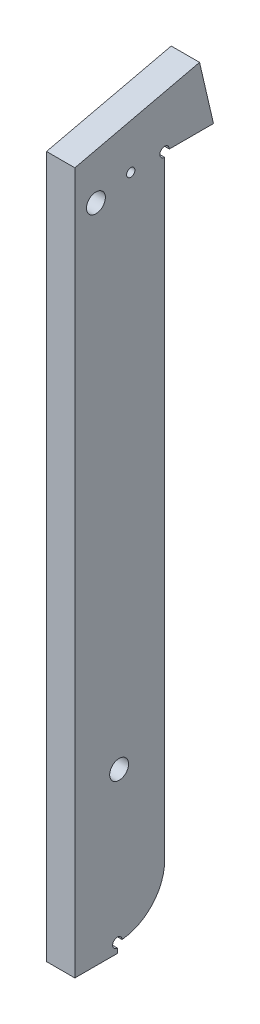
ISO-10303-21;
HEADER;
FILE_DESCRIPTION(('STEP AP214'),'2;1');
FILE_NAME('part.step','',(''),(''),'','','');
FILE_SCHEMA(('AUTOMOTIVE_DESIGN { 1 0 10303 214 1 1 1 1 }'));
ENDSEC;
DATA;
#1=APPLICATION_CONTEXT('core data for automotive mechanical design processes');
#2=APPLICATION_PROTOCOL_DEFINITION('international standard','automotive_design',2000,#1);
#3=PRODUCT_CONTEXT('',#1,'mechanical');
#4=PRODUCT('Part','Part','',(#3));
#5=PRODUCT_RELATED_PRODUCT_CATEGORY('part','',(#4));
#6=PRODUCT_DEFINITION_FORMATION('','',#4);
#7=PRODUCT_DEFINITION_CONTEXT('part definition',#1,'design');
#8=PRODUCT_DEFINITION('design','',#6,#7);
#9=PRODUCT_DEFINITION_SHAPE('','',#8);
#10=(LENGTH_UNIT() NAMED_UNIT(*) SI_UNIT(.MILLI.,.METRE.));
#11=(NAMED_UNIT(*) PLANE_ANGLE_UNIT() SI_UNIT($,.RADIAN.));
#12=(NAMED_UNIT(*) SI_UNIT($,.STERADIAN.) SOLID_ANGLE_UNIT());
#13=UNCERTAINTY_MEASURE_WITH_UNIT(LENGTH_MEASURE(1.E-05),#10,'distance_accuracy_value','');
#14=(GEOMETRIC_REPRESENTATION_CONTEXT(3) GLOBAL_UNCERTAINTY_ASSIGNED_CONTEXT((#13)) GLOBAL_UNIT_ASSIGNED_CONTEXT((#10,
#11,#12)) REPRESENTATION_CONTEXT('',''));
#15=CARTESIAN_POINT('',(0.,0.,0.));
#16=DIRECTION('',(0.,0.,1.));
#17=DIRECTION('',(1.,0.,0.));
#18=AXIS2_PLACEMENT_3D('',#15,#16,#17);
#19=CARTESIAN_POINT('',(-228.088766336441,1.77635683940025E-12,-66.675));
#20=DIRECTION('',(1.,0.,0.));
#21=DIRECTION('',(0.,1.,0.));
#22=AXIS2_PLACEMENT_3D('',#19,#20,#21);
#23=PLANE('',#22);
#24=CARTESIAN_POINT('',(-228.088766336441,-0.660555348845376,-37.580125219567));
#25=DIRECTION('',(1.,0.,0.));
#26=DIRECTION('',(0.,0.,-1.));
#27=AXIS2_PLACEMENT_3D('',#24,#25,#26);
#28=CIRCLE('',#27,6.35000000000002);
#29=CARTESIAN_POINT('',(-228.088766336441,-0.660555348845376,-43.930125219567));
#30=VERTEX_POINT('',#29);
#31=EDGE_CURVE('E232',#30,#30,#28,.T.);
#32=ORIENTED_EDGE('',*,*,#31,.T.);
#33=EDGE_LOOP('',(#32));
#34=FACE_BOUND('',#33,.T.);
#35=DIRECTION('',(0.,-1.,0.));
#36=VECTOR('',#35,1.);
#37=CARTESIAN_POINT('',(-228.088766336441,-450.85,-28.575));
#38=LINE('',#37,#36);
#39=CARTESIAN_POINT('',(-228.088766336441,-447.675,-28.575));
#40=VERTEX_POINT('',#39);
#41=CARTESIAN_POINT('',(-228.088766336441,-450.85,-28.575));
#42=VERTEX_POINT('',#41);
#43=EDGE_CURVE('E140',#40,#42,#38,.T.);
#44=ORIENTED_EDGE('',*,*,#43,.T.);
#45=DIRECTION('',(0.,0.,1.));
#46=VECTOR('',#45,1.);
#47=CARTESIAN_POINT('',(-228.088766336441,-450.85,-66.675));
#48=LINE('',#47,#46);
#49=CARTESIAN_POINT('',(-228.088766336441,-450.85,0.));
#50=VERTEX_POINT('',#49);
#51=EDGE_CURVE('E156',#42,#50,#48,.T.);
#52=ORIENTED_EDGE('',*,*,#51,.T.);
#53=DIRECTION('',(0.,-1.,0.));
#54=VECTOR('',#53,1.);
#55=CARTESIAN_POINT('',(-228.088766336441,1.77635683940025E-12,0.));
#56=LINE('',#55,#54);
#57=CARTESIAN_POINT('',(-228.088766336441,20.8246330030108,0.));
#58=VERTEX_POINT('',#57);
#59=EDGE_CURVE('E144',#58,#50,#56,.T.);
#60=ORIENTED_EDGE('',*,*,#59,.F.);
#61=DIRECTION('',(0.,-0.226373338950912,0.974040610761284));
#62=VECTOR('',#61,1.);
#63=CARTESIAN_POINT('',(-228.088766336441,34.844553241799,-60.325));
#64=LINE('',#63,#62);
#65=CARTESIAN_POINT('',(-228.088766336441,40.3069419106845,-83.8285999376698));
#66=VERTEX_POINT('',#65);
#67=EDGE_CURVE('E192',#66,#58,#64,.T.);
#68=ORIENTED_EDGE('',*,*,#67,.F.);
#69=DIRECTION('',(0.,0.974040610761285,0.226373338950908));
#70=VECTOR('',#69,1.);
#71=CARTESIAN_POINT('',(-228.088766336441,40.3069419106845,-83.8285999376698));
#72=LINE('',#71,#70);
#73=CARTESIAN_POINT('',(-228.088766336441,0.,-93.19619398089));
#74=VERTEX_POINT('',#73);
#75=EDGE_CURVE('E183',#74,#66,#72,.T.);
#76=ORIENTED_EDGE('',*,*,#75,.F.);
#77=DIRECTION('',(0.,0.,-1.));
#78=VECTOR('',#77,1.);
#79=CARTESIAN_POINT('',(-228.088766336441,0.,-93.19619398089));
#80=LINE('',#79,#78);
#81=CARTESIAN_POINT('',(-228.088766336441,0.,-63.5));
#82=VERTEX_POINT('',#81);
#83=EDGE_CURVE('E174',#82,#74,#80,.T.);
#84=ORIENTED_EDGE('',*,*,#83,.F.);
#85=CARTESIAN_POINT('',(-228.088766336441,0.,-60.325));
#86=DIRECTION('',(1.,0.,0.));
#87=DIRECTION('',(0.,0.,-1.));
#88=AXIS2_PLACEMENT_3D('',#85,#86,#87);
#89=CIRCLE('',#88,3.175);
#90=CARTESIAN_POINT('',(-228.088766336441,-3.17500000000002,-60.325));
#91=VERTEX_POINT('',#90);
#92=EDGE_CURVE('E117',#82,#91,#89,.T.);
#93=ORIENTED_EDGE('',*,*,#92,.T.);
#94=DIRECTION('',(0.,-1.,0.));
#95=VECTOR('',#94,1.);
#96=CARTESIAN_POINT('',(-228.088766336441,1.77635683940025E-12,-60.325));
#97=LINE('',#96,#95);
#98=CARTESIAN_POINT('',(-228.088766336441,-412.75,-60.325));
#99=VERTEX_POINT('',#98);
#100=EDGE_CURVE('E130',#91,#99,#97,.T.);
#101=ORIENTED_EDGE('',*,*,#100,.T.);
#102=CARTESIAN_POINT('',(-228.088766336441,-412.75,-28.575));
#103=DIRECTION('',(-1.,0.,0.));
#104=DIRECTION('',(0.,-1.,0.));
#105=AXIS2_PLACEMENT_3D('',#102,#103,#104);
#106=CIRCLE('',#105,31.75);
#107=CARTESIAN_POINT('',(-228.088766336441,-444.34125,-31.7460287664258));
#108=VERTEX_POINT('',#107);
#109=EDGE_CURVE('E138',#99,#108,#106,.T.);
#110=ORIENTED_EDGE('',*,*,#109,.T.);
#111=CARTESIAN_POINT('',(-228.088766336441,-444.5,-28.575));
#112=DIRECTION('',(1.,0.,0.));
#113=DIRECTION('',(0.,0.,-1.));
#114=AXIS2_PLACEMENT_3D('',#111,#112,#113);
#115=CIRCLE('',#114,3.17499999999998);
#116=EDGE_CURVE('E112',#108,#40,#115,.T.);
#117=ORIENTED_EDGE('',*,*,#116,.T.);
#118=EDGE_LOOP('',(#44,#52,#60,#68,#76,#84,#93,#101,#110,#117));
#119=FACE_BOUND('',#118,.T.);
#120=CARTESIAN_POINT('',(-228.088766336441,-6.64676298919709,-14.175520602931));
#121=DIRECTION('',(1.,0.,0.));
#122=DIRECTION('',(0.,0.,-1.));
#123=AXIS2_PLACEMENT_3D('',#120,#121,#122);
#124=CIRCLE('',#123,6.34999999999999);
#125=CARTESIAN_POINT('',(-228.088766336441,-6.64676298919709,-20.525520602931));
#126=VERTEX_POINT('',#125);
#127=EDGE_CURVE('E241',#126,#126,#124,.T.);
#128=ORIENTED_EDGE('',*,*,#127,.T.);
#129=EDGE_LOOP('',(#128));
#130=FACE_BOUND('',#129,.T.);
#131=CARTESIAN_POINT('',(-228.088766336441,-344.263413995719,-29.772711998703));
#132=DIRECTION('',(-1.,0.,0.));
#133=DIRECTION('',(0.,0.,1.));
#134=AXIS2_PLACEMENT_3D('',#131,#132,#133);
#135=CIRCLE('',#134,6.35000000000002);
#136=CARTESIAN_POINT('',(-228.088766336441,-344.263413995719,-23.422711998703));
#137=VERTEX_POINT('',#136);
#138=EDGE_CURVE('E346',#137,#137,#135,.T.);
#139=ORIENTED_EDGE('',*,*,#138,.F.);
#140=EDGE_LOOP('',(#139));
#141=FACE_BOUND('',#140,.T.);
#142=ADVANCED_FACE('F32',(#34,#119,#130,#141),#23,.F.);
#143=CARTESIAN_POINT('',(-228.088766336441,-450.85,-66.675));
#144=DIRECTION('',(0.,1.,0.));
#145=DIRECTION('',(0.,0.,-1.));
#146=AXIS2_PLACEMENT_3D('',#143,#144,#145);
#147=PLANE('',#146);
#148=DIRECTION('',(0.,0.,1.));
#149=VECTOR('',#148,1.);
#150=CARTESIAN_POINT('',(-209.038766336441,-450.85,-66.675));
#151=LINE('',#150,#149);
#152=CARTESIAN_POINT('',(-209.038766336441,-450.85,-28.575));
#153=VERTEX_POINT('',#152);
#154=CARTESIAN_POINT('',(-209.038766336441,-450.85,0.));
#155=VERTEX_POINT('',#154);
#156=EDGE_CURVE('E153',#153,#155,#151,.T.);
#157=ORIENTED_EDGE('',*,*,#156,.T.);
#158=DIRECTION('',(1.,0.,0.));
#159=VECTOR('',#158,1.);
#160=CARTESIAN_POINT('',(-228.088766336441,-450.85,0.));
#161=LINE('',#160,#159);
#162=EDGE_CURVE('E147',#50,#155,#161,.T.);
#163=ORIENTED_EDGE('',*,*,#162,.F.);
#164=ORIENTED_EDGE('',*,*,#51,.F.);
#165=DIRECTION('',(1.,0.,0.));
#166=VECTOR('',#165,1.);
#167=CARTESIAN_POINT('',(-228.088766336441,-450.85,-28.575));
#168=LINE('',#167,#166);
#169=EDGE_CURVE('E159',#153,#42,#168,.F.);
#170=ORIENTED_EDGE('',*,*,#169,.F.);
#171=EDGE_LOOP('',(#157,#163,#164,#170));
#172=FACE_BOUND('',#171,.T.);
#173=ADVANCED_FACE('F208',(#172),#147,.F.);
#174=CARTESIAN_POINT('',(-209.038766336441,0.,-66.675));
#175=DIRECTION('',(-1.,0.,0.));
#176=DIRECTION('',(0.,-1.,0.));
#177=AXIS2_PLACEMENT_3D('',#174,#175,#176);
#178=PLANE('',#177);
#179=CARTESIAN_POINT('',(-209.038766336441,-344.263413995719,-29.772711998703));
#180=DIRECTION('',(-1.,0.,0.));
#181=DIRECTION('',(0.,-1.,0.));
#182=AXIS2_PLACEMENT_3D('',#179,#180,#181);
#183=CIRCLE('',#182,6.35000000000002);
#184=CARTESIAN_POINT('',(-209.038766336441,-350.613413995719,-29.772711998703));
#185=VERTEX_POINT('',#184);
#186=EDGE_CURVE('E269',#185,#185,#183,.T.);
#187=ORIENTED_EDGE('',*,*,#186,.T.);
#188=EDGE_LOOP('',(#187));
#189=FACE_BOUND('',#188,.T.);
#190=CARTESIAN_POINT('',(-209.038766336441,-6.64676298919709,-14.175520602931));
#191=DIRECTION('',(1.,0.,0.));
#192=DIRECTION('',(0.,-1.,0.));
#193=AXIS2_PLACEMENT_3D('',#190,#191,#192);
#194=CIRCLE('',#193,6.34999999999999);
#195=CARTESIAN_POINT('',(-209.038766336441,-12.9967629891971,-14.175520602931));
#196=VERTEX_POINT('',#195);
#197=EDGE_CURVE('E235',#196,#196,#194,.T.);
#198=ORIENTED_EDGE('',*,*,#197,.F.);
#199=EDGE_LOOP('',(#198));
#200=FACE_BOUND('',#199,.T.);
#201=CARTESIAN_POINT('',(-209.038766336441,-0.660555348845376,-37.580125219567));
#202=DIRECTION('',(1.,0.,0.));
#203=DIRECTION('',(0.,-1.,0.));
#204=AXIS2_PLACEMENT_3D('',#201,#202,#203);
#205=CIRCLE('',#204,2.80670000000001);
#206=CARTESIAN_POINT('',(-209.038766336441,-3.46725534884539,-37.580125219567));
#207=VERTEX_POINT('',#206);
#208=EDGE_CURVE('E247',#207,#207,#205,.T.);
#209=ORIENTED_EDGE('',*,*,#208,.F.);
#210=EDGE_LOOP('',(#209));
#211=FACE_BOUND('',#210,.T.);
#212=CARTESIAN_POINT('',(-209.038766336441,-412.75,-28.575));
#213=DIRECTION('',(1.,0.,0.));
#214=DIRECTION('',(0.,-1.,0.));
#215=AXIS2_PLACEMENT_3D('',#212,#213,#214);
#216=CIRCLE('',#215,31.75);
#217=CARTESIAN_POINT('',(-209.038766336441,-444.34125,-31.7460287664258));
#218=VERTEX_POINT('',#217);
#219=CARTESIAN_POINT('',(-209.038766336441,-412.75,-60.325));
#220=VERTEX_POINT('',#219);
#221=EDGE_CURVE('E123',#218,#220,#216,.T.);
#222=ORIENTED_EDGE('',*,*,#221,.T.);
#223=DIRECTION('',(0.,1.,0.));
#224=VECTOR('',#223,1.);
#225=CARTESIAN_POINT('',(-209.038766336441,1.77870238100157E-12,-60.325));
#226=LINE('',#225,#224);
#227=CARTESIAN_POINT('',(-209.038766336441,-3.17500000000002,-60.325));
#228=VERTEX_POINT('',#227);
#229=EDGE_CURVE('E128',#220,#228,#226,.T.);
#230=ORIENTED_EDGE('',*,*,#229,.T.);
#231=CARTESIAN_POINT('',(-209.038766336441,0.,-60.325));
#232=DIRECTION('',(1.,0.,0.));
#233=DIRECTION('',(0.,-1.,0.));
#234=AXIS2_PLACEMENT_3D('',#231,#232,#233);
#235=CIRCLE('',#234,3.175);
#236=CARTESIAN_POINT('',(-209.038766336441,1.00223476074274E-12,-63.5));
#237=VERTEX_POINT('',#236);
#238=EDGE_CURVE('E39',#237,#228,#235,.T.);
#239=ORIENTED_EDGE('',*,*,#238,.F.);
#240=DIRECTION('',(0.,0.,-1.));
#241=VECTOR('',#240,1.);
#242=CARTESIAN_POINT('',(-209.038766336441,0.,-93.19619398089));
#243=LINE('',#242,#241);
#244=CARTESIAN_POINT('',(-209.038766336441,0.,-93.19619398089));
#245=VERTEX_POINT('',#244);
#246=EDGE_CURVE('E180',#237,#245,#243,.T.);
#247=ORIENTED_EDGE('',*,*,#246,.T.);
#248=DIRECTION('',(0.,0.974040610761285,0.226373338950908));
#249=VECTOR('',#248,1.);
#250=CARTESIAN_POINT('',(-209.038766336441,40.3069419106845,-83.8285999376698));
#251=LINE('',#250,#249);
#252=CARTESIAN_POINT('',(-209.038766336441,40.3069419106845,-83.8285999376698));
#253=VERTEX_POINT('',#252);
#254=EDGE_CURVE('E182',#245,#253,#251,.T.);
#255=ORIENTED_EDGE('',*,*,#254,.T.);
#256=DIRECTION('',(0.,-0.226373338950912,0.974040610761284));
#257=VECTOR('',#256,1.);
#258=CARTESIAN_POINT('',(-209.038766336441,34.844553241799,-60.325));
#259=LINE('',#258,#257);
#260=CARTESIAN_POINT('',(-209.038766336441,20.8246330030108,0.));
#261=VERTEX_POINT('',#260);
#262=EDGE_CURVE('E194',#253,#261,#259,.T.);
#263=ORIENTED_EDGE('',*,*,#262,.T.);
#264=DIRECTION('',(0.,1.,0.));
#265=VECTOR('',#264,1.);
#266=CARTESIAN_POINT('',(-209.038766336441,0.,0.));
#267=LINE('',#266,#265);
#268=EDGE_CURVE('E150',#155,#261,#267,.T.);
#269=ORIENTED_EDGE('',*,*,#268,.F.);
#270=ORIENTED_EDGE('',*,*,#156,.F.);
#271=DIRECTION('',(0.,1.,0.));
#272=VECTOR('',#271,1.);
#273=CARTESIAN_POINT('',(-209.038766336441,-450.85,-28.575));
#274=LINE('',#273,#272);
#275=CARTESIAN_POINT('',(-209.038766336441,-447.675,-28.575));
#276=VERTEX_POINT('',#275);
#277=EDGE_CURVE('E125',#153,#276,#274,.T.);
#278=ORIENTED_EDGE('',*,*,#277,.T.);
#279=CARTESIAN_POINT('',(-209.038766336441,-444.5,-28.575));
#280=DIRECTION('',(1.,0.,0.));
#281=DIRECTION('',(0.,-1.,0.));
#282=AXIS2_PLACEMENT_3D('',#279,#280,#281);
#283=CIRCLE('',#282,3.17499999999998);
#284=EDGE_CURVE('E11',#218,#276,#283,.T.);
#285=ORIENTED_EDGE('',*,*,#284,.F.);
#286=EDGE_LOOP('',(#222,#230,#239,#247,#255,#263,#269,#270,#278,#285));
#287=FACE_BOUND('',#286,.T.);
#288=ADVANCED_FACE('F121',(#189,#200,#211,#287),#178,.F.);
#289=CARTESIAN_POINT('',(0.,0.,0.));
#290=DIRECTION('',(0.,0.,-1.));
#291=DIRECTION('',(1.,0.,0.));
#292=AXIS2_PLACEMENT_3D('',#289,#290,#291);
#293=PLANE('',#292);
#294=ORIENTED_EDGE('',*,*,#59,.T.);
#295=ORIENTED_EDGE('',*,*,#162,.T.);
#296=ORIENTED_EDGE('',*,*,#268,.T.);
#297=DIRECTION('',(-1.,0.,0.));
#298=VECTOR('',#297,1.);
#299=CARTESIAN_POINT('',(-209.038766336441,20.8246330030108,0.));
#300=LINE('',#299,#298);
#301=EDGE_CURVE('E132',#261,#58,#300,.T.);
#302=ORIENTED_EDGE('',*,*,#301,.T.);
#303=EDGE_LOOP('',(#294,#295,#296,#302));
#304=FACE_BOUND('',#303,.T.);
#305=ADVANCED_FACE('F199',(#304),#293,.F.);
#306=CARTESIAN_POINT('',(-209.037766336441,-450.85,-28.575));
#307=DIRECTION('',(0.,0.,1.));
#308=DIRECTION('',(0.,1.,0.));
#309=AXIS2_PLACEMENT_3D('',#306,#307,#308);
#310=PLANE('',#309);
#311=ORIENTED_EDGE('',*,*,#277,.F.);
#312=ORIENTED_EDGE('',*,*,#169,.T.);
#313=ORIENTED_EDGE('',*,*,#43,.F.);
#314=DIRECTION('',(-1.,0.,0.));
#315=VECTOR('',#314,1.);
#316=CARTESIAN_POINT('',(-228.088766336441,-447.675,-28.575));
#317=LINE('',#316,#315);
#318=EDGE_CURVE('E46',#276,#40,#317,.T.);
#319=ORIENTED_EDGE('',*,*,#318,.F.);
#320=EDGE_LOOP('',(#311,#312,#313,#319));
#321=FACE_BOUND('',#320,.T.);
#322=ADVANCED_FACE('F250',(#321),#310,.F.);
#323=CARTESIAN_POINT('',(-209.037766336441,-412.75,-28.575));
#324=DIRECTION('',(-1.,0.,0.));
#325=DIRECTION('',(0.,-1.,0.));
#326=AXIS2_PLACEMENT_3D('',#323,#324,#325);
#327=CYLINDRICAL_SURFACE('',#326,31.75);
#328=ORIENTED_EDGE('',*,*,#109,.F.);
#329=DIRECTION('',(-1.,0.,0.));
#330=VECTOR('',#329,1.);
#331=CARTESIAN_POINT('',(-209.037766336441,-412.75,-60.325));
#332=LINE('',#331,#330);
#333=EDGE_CURVE('E127',#220,#99,#332,.T.);
#334=ORIENTED_EDGE('',*,*,#333,.F.);
#335=ORIENTED_EDGE('',*,*,#221,.F.);
#336=DIRECTION('',(-1.,0.,0.));
#337=VECTOR('',#336,1.);
#338=CARTESIAN_POINT('',(-218.563766336441,-444.34125,-31.7460287664258));
#339=LINE('',#338,#337);
#340=EDGE_CURVE('E107',#108,#218,#339,.F.);
#341=ORIENTED_EDGE('',*,*,#340,.F.);
#342=EDGE_LOOP('',(#328,#334,#335,#341));
#343=FACE_BOUND('',#342,.T.);
#344=ADVANCED_FACE('F126',(#343),#327,.T.);
#345=CARTESIAN_POINT('',(-209.037766336441,1.77870250412711E-12,-60.325));
#346=DIRECTION('',(0.,0.,1.));
#347=DIRECTION('',(0.,1.,0.));
#348=AXIS2_PLACEMENT_3D('',#345,#346,#347);
#349=PLANE('',#348);
#350=ORIENTED_EDGE('',*,*,#229,.F.);
#351=ORIENTED_EDGE('',*,*,#333,.T.);
#352=ORIENTED_EDGE('',*,*,#100,.F.);
#353=DIRECTION('',(-1.,0.,0.));
#354=VECTOR('',#353,1.);
#355=CARTESIAN_POINT('',(-228.088766336441,-3.17500000000002,-60.325));
#356=LINE('',#355,#354);
#357=EDGE_CURVE('E53',#228,#91,#356,.T.);
#358=ORIENTED_EDGE('',*,*,#357,.F.);
#359=EDGE_LOOP('',(#350,#351,#352,#358));
#360=FACE_BOUND('',#359,.T.);
#361=ADVANCED_FACE('F167',(#360),#349,.F.);
#362=CARTESIAN_POINT('',(-209.038766336441,34.844553241799,-60.325));
#363=DIRECTION('',(0.,0.974040610761284,0.226373338950912));
#364=DIRECTION('',(0.,0.226373338950912,-0.974040610761284));
#365=AXIS2_PLACEMENT_3D('',#362,#363,#364);
#366=PLANE('',#365);
#367=ORIENTED_EDGE('',*,*,#67,.T.);
#368=ORIENTED_EDGE('',*,*,#301,.F.);
#369=ORIENTED_EDGE('',*,*,#262,.F.);
#370=DIRECTION('',(-1.,0.,0.));
#371=VECTOR('',#370,1.);
#372=CARTESIAN_POINT('',(-209.038766336441,40.3069419106845,-83.8285999376698));
#373=LINE('',#372,#371);
#374=EDGE_CURVE('E190',#253,#66,#373,.T.);
#375=ORIENTED_EDGE('',*,*,#374,.T.);
#376=EDGE_LOOP('',(#367,#368,#369,#375));
#377=FACE_BOUND('',#376,.T.);
#378=ADVANCED_FACE('F204',(#377),#366,.T.);
#379=CARTESIAN_POINT('',(-209.038766336441,40.3069419106845,-83.8285999376698));
#380=DIRECTION('',(0.,0.226373338950908,-0.974040610761285));
#381=DIRECTION('',(0.,-0.974040610761285,-0.226373338950908));
#382=AXIS2_PLACEMENT_3D('',#379,#380,#381);
#383=PLANE('',#382);
#384=ORIENTED_EDGE('',*,*,#75,.T.);
#385=ORIENTED_EDGE('',*,*,#374,.F.);
#386=ORIENTED_EDGE('',*,*,#254,.F.);
#387=DIRECTION('',(-1.,0.,0.));
#388=VECTOR('',#387,1.);
#389=CARTESIAN_POINT('',(-209.038766336441,0.,-93.19619398089));
#390=LINE('',#389,#388);
#391=EDGE_CURVE('E186',#245,#74,#390,.T.);
#392=ORIENTED_EDGE('',*,*,#391,.T.);
#393=EDGE_LOOP('',(#384,#385,#386,#392));
#394=FACE_BOUND('',#393,.T.);
#395=ADVANCED_FACE('F211',(#394),#383,.T.);
#396=CARTESIAN_POINT('',(-209.038766336441,0.,-93.19619398089));
#397=DIRECTION('',(0.,-1.,0.));
#398=DIRECTION('',(0.,0.,1.));
#399=AXIS2_PLACEMENT_3D('',#396,#397,#398);
#400=PLANE('',#399);
#401=DIRECTION('',(-1.,0.,0.));
#402=VECTOR('',#401,1.);
#403=CARTESIAN_POINT('',(-228.088766336441,9.99889219141416E-13,-63.5));
#404=LINE('',#403,#402);
#405=EDGE_CURVE('E164',#237,#82,#404,.T.);
#406=ORIENTED_EDGE('',*,*,#405,.T.);
#407=ORIENTED_EDGE('',*,*,#83,.T.);
#408=ORIENTED_EDGE('',*,*,#391,.F.);
#409=ORIENTED_EDGE('',*,*,#246,.F.);
#410=EDGE_LOOP('',(#406,#407,#408,#409));
#411=FACE_BOUND('',#410,.T.);
#412=ADVANCED_FACE('F213',(#411),#400,.T.);
#413=CARTESIAN_POINT('',(-228.088766336441,0.,-60.325));
#414=DIRECTION('',(-1.,0.,0.));
#415=DIRECTION('',(0.,0.,-1.));
#416=AXIS2_PLACEMENT_3D('',#413,#414,#415);
#417=CYLINDRICAL_SURFACE('',#416,3.175);
#418=ORIENTED_EDGE('',*,*,#238,.T.);
#419=ORIENTED_EDGE('',*,*,#357,.T.);
#420=ORIENTED_EDGE('',*,*,#92,.F.);
#421=ORIENTED_EDGE('',*,*,#405,.F.);
#422=EDGE_LOOP('',(#418,#419,#420,#421));
#423=FACE_BOUND('',#422,.T.);
#424=ADVANCED_FACE('F162',(#423),#417,.F.);
#425=CARTESIAN_POINT('',(-228.088766336441,-444.5,-28.575));
#426=DIRECTION('',(-1.,0.,0.));
#427=DIRECTION('',(0.,0.,-1.));
#428=AXIS2_PLACEMENT_3D('',#425,#426,#427);
#429=CYLINDRICAL_SURFACE('',#428,3.17499999999998);
#430=ORIENTED_EDGE('',*,*,#116,.F.);
#431=ORIENTED_EDGE('',*,*,#340,.T.);
#432=ORIENTED_EDGE('',*,*,#284,.T.);
#433=ORIENTED_EDGE('',*,*,#318,.T.);
#434=EDGE_LOOP('',(#430,#431,#432,#433));
#435=FACE_BOUND('',#434,.T.);
#436=ADVANCED_FACE('F109',(#435),#429,.F.);
#437=CARTESIAN_POINT('',(-228.088766336441,-0.660555348845376,-37.580125219567));
#438=DIRECTION('',(-1.,0.,0.));
#439=DIRECTION('',(0.,0.,-1.));
#440=AXIS2_PLACEMENT_3D('',#437,#438,#439);
#441=CYLINDRICAL_SURFACE('',#440,2.80670000000001);
#442=ORIENTED_EDGE('',*,*,#208,.T.);
#443=EDGE_LOOP('',(#442));
#444=FACE_BOUND('',#443,.T.);
#445=CARTESIAN_POINT('',(-221.738766336441,-0.660555348845376,-37.580125219567));
#446=DIRECTION('',(1.,0.,0.));
#447=DIRECTION('',(0.,0.,-1.));
#448=AXIS2_PLACEMENT_3D('',#445,#446,#447);
#449=CIRCLE('',#448,2.80670000000001);
#450=CARTESIAN_POINT('',(-221.738766336441,-0.660555348845376,-40.386825219567));
#451=VERTEX_POINT('',#450);
#452=EDGE_CURVE('E238',#451,#451,#449,.T.);
#453=ORIENTED_EDGE('',*,*,#452,.F.);
#454=EDGE_LOOP('',(#453));
#455=FACE_BOUND('',#454,.T.);
#456=ADVANCED_FACE('F274',(#444,#455),#441,.F.);
#457=CARTESIAN_POINT('',(-221.738766336441,2.14614465115464,-37.580125219567));
#458=DIRECTION('',(1.,0.,0.));
#459=DIRECTION('',(0.,0.,1.));
#460=AXIS2_PLACEMENT_3D('',#457,#458,#459);
#461=PLANE('',#460);
#462=ORIENTED_EDGE('',*,*,#452,.T.);
#463=EDGE_LOOP('',(#462));
#464=FACE_BOUND('',#463,.T.);
#465=CARTESIAN_POINT('',(-221.738766336441,-0.660555348845376,-37.580125219567));
#466=DIRECTION('',(1.,0.,0.));
#467=DIRECTION('',(0.,0.,-1.));
#468=AXIS2_PLACEMENT_3D('',#465,#466,#467);
#469=CIRCLE('',#468,6.35000000000001);
#470=CARTESIAN_POINT('',(-221.738766336441,-0.660555348845376,-43.930125219567));
#471=VERTEX_POINT('',#470);
#472=EDGE_CURVE('E234',#471,#471,#469,.T.);
#473=ORIENTED_EDGE('',*,*,#472,.F.);
#474=EDGE_LOOP('',(#473));
#475=FACE_BOUND('',#474,.T.);
#476=ADVANCED_FACE('F277',(#464,#475),#461,.F.);
#477=CARTESIAN_POINT('',(-228.088766336441,-0.660555348845376,-37.580125219567));
#478=DIRECTION('',(-1.,0.,0.));
#479=DIRECTION('',(0.,0.,-1.));
#480=AXIS2_PLACEMENT_3D('',#477,#478,#479);
#481=CYLINDRICAL_SURFACE('',#480,6.35000000000001);
#482=ORIENTED_EDGE('',*,*,#472,.T.);
#483=EDGE_LOOP('',(#482));
#484=FACE_BOUND('',#483,.T.);
#485=ORIENTED_EDGE('',*,*,#31,.F.);
#486=EDGE_LOOP('',(#485));
#487=FACE_BOUND('',#486,.T.);
#488=ADVANCED_FACE('F283',(#484,#487),#481,.F.);
#489=CARTESIAN_POINT('',(-228.088766336441,-6.64676298919709,-14.175520602931));
#490=DIRECTION('',(-1.,0.,0.));
#491=DIRECTION('',(0.,0.,-1.));
#492=AXIS2_PLACEMENT_3D('',#489,#490,#491);
#493=CYLINDRICAL_SURFACE('',#492,6.34999999999999);
#494=ORIENTED_EDGE('',*,*,#197,.T.);
#495=EDGE_LOOP('',(#494));
#496=FACE_BOUND('',#495,.T.);
#497=ORIENTED_EDGE('',*,*,#127,.F.);
#498=EDGE_LOOP('',(#497));
#499=FACE_BOUND('',#498,.T.);
#500=ADVANCED_FACE('F288',(#496,#499),#493,.F.);
#501=CARTESIAN_POINT('',(-228.088766336441,-344.263413995719,-29.772711998703));
#502=DIRECTION('',(-1.,0.,0.));
#503=DIRECTION('',(0.,0.,1.));
#504=AXIS2_PLACEMENT_3D('',#501,#502,#503);
#505=CYLINDRICAL_SURFACE('',#504,6.35000000000002);
#506=ORIENTED_EDGE('',*,*,#186,.F.);
#507=EDGE_LOOP('',(#506));
#508=FACE_BOUND('',#507,.T.);
#509=ORIENTED_EDGE('',*,*,#138,.T.);
#510=EDGE_LOOP('',(#509));
#511=FACE_BOUND('',#510,.T.);
#512=ADVANCED_FACE('F293',(#508,#511),#505,.F.);
#513=CLOSED_SHELL('',(#142,#173,#288,#305,#322,#344,#361,#378,#395,#412,#424,#436,#456,#476,
#488,#500,#512));
#514=MANIFOLD_SOLID_BREP('B2',#513);
#515=ADVANCED_BREP_SHAPE_REPRESENTATION('',(#18,#514),#14);
#516=SHAPE_DEFINITION_REPRESENTATION(#9,#515);
ENDSEC;
END-ISO-10303-21;
